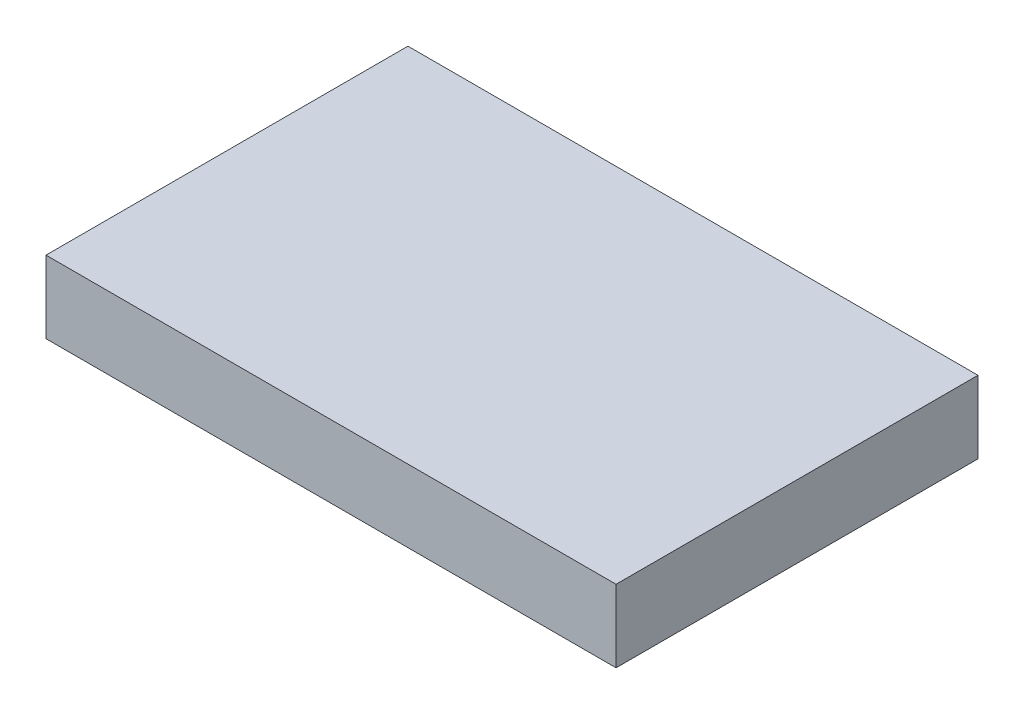
ISO-10303-21;
HEADER;
FILE_DESCRIPTION(('STEP AP214'),'2;1');
FILE_NAME('part.step','',(''),(''),'','','');
FILE_SCHEMA(('AUTOMOTIVE_DESIGN { 1 0 10303 214 1 1 1 1 }'));
ENDSEC;
DATA;
#1=APPLICATION_CONTEXT('core data for automotive mechanical design processes');
#2=APPLICATION_PROTOCOL_DEFINITION('international standard','automotive_design',2000,#1);
#3=PRODUCT_CONTEXT('',#1,'mechanical');
#4=PRODUCT('Part','Part','',(#3));
#5=PRODUCT_RELATED_PRODUCT_CATEGORY('part','',(#4));
#6=PRODUCT_DEFINITION_FORMATION('','',#4);
#7=PRODUCT_DEFINITION_CONTEXT('part definition',#1,'design');
#8=PRODUCT_DEFINITION('design','',#6,#7);
#9=PRODUCT_DEFINITION_SHAPE('','',#8);
#10=(LENGTH_UNIT() NAMED_UNIT(*) SI_UNIT(.MILLI.,.METRE.));
#11=(NAMED_UNIT(*) PLANE_ANGLE_UNIT() SI_UNIT($,.RADIAN.));
#12=(NAMED_UNIT(*) SI_UNIT($,.STERADIAN.) SOLID_ANGLE_UNIT());
#13=UNCERTAINTY_MEASURE_WITH_UNIT(LENGTH_MEASURE(1.E-05),#10,'distance_accuracy_value','');
#14=(GEOMETRIC_REPRESENTATION_CONTEXT(3) GLOBAL_UNCERTAINTY_ASSIGNED_CONTEXT((#13)) GLOBAL_UNIT_ASSIGNED_CONTEXT((#10,
#11,#12)) REPRESENTATION_CONTEXT('',''));
#15=CARTESIAN_POINT('',(0.,0.,0.));
#16=DIRECTION('',(0.,0.,1.));
#17=DIRECTION('',(1.,0.,0.));
#18=AXIS2_PLACEMENT_3D('',#15,#16,#17);
#19=CARTESIAN_POINT('',(0.,6.35000000000002,0.));
#20=DIRECTION('',(1.,0.,0.));
#21=DIRECTION('',(0.,0.,-1.));
#22=AXIS2_PLACEMENT_3D('',#19,#20,#21);
#23=PLANE('',#22);
#24=DIRECTION('',(0.,0.,1.));
#25=VECTOR('',#24,1.);
#26=CARTESIAN_POINT('',(0.,0.,0.));
#27=LINE('',#26,#25);
#28=CARTESIAN_POINT('',(0.,0.,-304.8));
#29=VERTEX_POINT('',#28);
#30=CARTESIAN_POINT('',(0.,0.,-273.05));
#31=VERTEX_POINT('',#30);
#32=EDGE_CURVE('E99',#29,#31,#27,.T.);
#33=ORIENTED_EDGE('',*,*,#32,.T.);
#34=DIRECTION('',(0.,1.,0.));
#35=VECTOR('',#34,1.);
#36=CARTESIAN_POINT('',(0.,0.,-273.05));
#37=LINE('',#36,#35);
#38=CARTESIAN_POINT('',(0.,6.35000000000002,-273.05));
#39=VERTEX_POINT('',#38);
#40=EDGE_CURVE('E48',#31,#39,#37,.T.);
#41=ORIENTED_EDGE('',*,*,#40,.T.);
#42=DIRECTION('',(0.,0.,1.));
#43=VECTOR('',#42,1.);
#44=CARTESIAN_POINT('',(0.,6.35000000000002,0.));
#45=LINE('',#44,#43);
#46=CARTESIAN_POINT('',(0.,6.35000000000002,-304.8));
#47=VERTEX_POINT('',#46);
#48=EDGE_CURVE('E101',#47,#39,#45,.T.);
#49=ORIENTED_EDGE('',*,*,#48,.F.);
#50=DIRECTION('',(0.,-1.,0.));
#51=VECTOR('',#50,1.);
#52=CARTESIAN_POINT('',(0.,6.35000000000002,-304.8));
#53=LINE('',#52,#51);
#54=EDGE_CURVE('E11',#47,#29,#53,.T.);
#55=ORIENTED_EDGE('',*,*,#54,.T.);
#56=EDGE_LOOP('',(#33,#41,#49,#55));
#57=FACE_BOUND('',#56,.T.);
#58=ADVANCED_FACE('F34',(#57),#23,.F.);
#59=CARTESIAN_POINT('',(0.,6.35000000000002,-304.8));
#60=DIRECTION('',(0.,0.,1.));
#61=DIRECTION('',(1.,0.,0.));
#62=AXIS2_PLACEMENT_3D('',#59,#60,#61);
#63=PLANE('',#62);
#64=DIRECTION('',(-1.,0.,0.));
#65=VECTOR('',#64,1.);
#66=CARTESIAN_POINT('',(0.,6.35000000000002,-304.8));
#67=LINE('',#66,#65);
#68=CARTESIAN_POINT('',(50.00625,6.35000000000002,-304.8));
#69=VERTEX_POINT('',#68);
#70=EDGE_CURVE('E41',#69,#47,#67,.T.);
#71=ORIENTED_EDGE('',*,*,#70,.F.);
#72=DIRECTION('',(0.,1.,0.));
#73=VECTOR('',#72,1.);
#74=CARTESIAN_POINT('',(50.00625,0.,-304.8));
#75=LINE('',#74,#73);
#76=CARTESIAN_POINT('',(50.00625,0.,-304.8));
#77=VERTEX_POINT('',#76);
#78=EDGE_CURVE('E97',#77,#69,#75,.T.);
#79=ORIENTED_EDGE('',*,*,#78,.F.);
#80=DIRECTION('',(-1.,0.,0.));
#81=VECTOR('',#80,1.);
#82=CARTESIAN_POINT('',(0.,0.,-304.8));
#83=LINE('',#82,#81);
#84=EDGE_CURVE('E91',#77,#29,#83,.T.);
#85=ORIENTED_EDGE('',*,*,#84,.T.);
#86=ORIENTED_EDGE('',*,*,#54,.F.);
#87=EDGE_LOOP('',(#71,#79,#85,#86));
#88=FACE_BOUND('',#87,.T.);
#89=ADVANCED_FACE('F105',(#88),#63,.F.);
#90=CARTESIAN_POINT('',(0.,6.35000000000002,0.));
#91=DIRECTION('',(0.,-1.,0.));
#92=DIRECTION('',(0.,0.,-1.));
#93=AXIS2_PLACEMENT_3D('',#90,#91,#92);
#94=PLANE('',#93);
#95=DIRECTION('',(-1.,0.,0.));
#96=VECTOR('',#95,1.);
#97=CARTESIAN_POINT('',(50.00625,6.35000000000002,-273.05));
#98=LINE('',#97,#96);
#99=CARTESIAN_POINT('',(50.00625,6.35000000000002,-273.05));
#100=VERTEX_POINT('',#99);
#101=EDGE_CURVE('E92',#100,#39,#98,.T.);
#102=ORIENTED_EDGE('',*,*,#101,.F.);
#103=DIRECTION('',(0.,0.,1.));
#104=VECTOR('',#103,1.);
#105=CARTESIAN_POINT('',(50.00625,6.35000000000002,-304.8));
#106=LINE('',#105,#104);
#107=EDGE_CURVE('E80',#69,#100,#106,.T.);
#108=ORIENTED_EDGE('',*,*,#107,.F.);
#109=ORIENTED_EDGE('',*,*,#70,.T.);
#110=ORIENTED_EDGE('',*,*,#48,.T.);
#111=EDGE_LOOP('',(#102,#108,#109,#110));
#112=FACE_BOUND('',#111,.T.);
#113=ADVANCED_FACE('F108',(#112),#94,.F.);
#114=CARTESIAN_POINT('',(0.,0.,0.));
#115=DIRECTION('',(0.,-1.,0.));
#116=DIRECTION('',(0.,0.,-1.));
#117=AXIS2_PLACEMENT_3D('',#114,#115,#116);
#118=PLANE('',#117);
#119=DIRECTION('',(0.,0.,1.));
#120=VECTOR('',#119,1.);
#121=CARTESIAN_POINT('',(50.00625,0.,-304.8));
#122=LINE('',#121,#120);
#123=CARTESIAN_POINT('',(50.00625,0.,-273.05));
#124=VERTEX_POINT('',#123);
#125=EDGE_CURVE('E78',#77,#124,#122,.T.);
#126=ORIENTED_EDGE('',*,*,#125,.T.);
#127=DIRECTION('',(-1.,0.,0.));
#128=VECTOR('',#127,1.);
#129=CARTESIAN_POINT('',(50.00625,0.,-273.05));
#130=LINE('',#129,#128);
#131=EDGE_CURVE('E82',#124,#31,#130,.T.);
#132=ORIENTED_EDGE('',*,*,#131,.T.);
#133=ORIENTED_EDGE('',*,*,#32,.F.);
#134=ORIENTED_EDGE('',*,*,#84,.F.);
#135=EDGE_LOOP('',(#126,#132,#133,#134));
#136=FACE_BOUND('',#135,.T.);
#137=ADVANCED_FACE('F90',(#136),#118,.T.);
#138=CARTESIAN_POINT('',(50.00625,0.,-304.8));
#139=DIRECTION('',(-1.,0.,0.));
#140=DIRECTION('',(0.,0.,1.));
#141=AXIS2_PLACEMENT_3D('',#138,#139,#140);
#142=PLANE('',#141);
#143=ORIENTED_EDGE('',*,*,#107,.T.);
#144=DIRECTION('',(0.,1.,0.));
#145=VECTOR('',#144,1.);
#146=CARTESIAN_POINT('',(50.00625,0.,-273.05));
#147=LINE('',#146,#145);
#148=EDGE_CURVE('E75',#124,#100,#147,.T.);
#149=ORIENTED_EDGE('',*,*,#148,.F.);
#150=ORIENTED_EDGE('',*,*,#125,.F.);
#151=ORIENTED_EDGE('',*,*,#78,.T.);
#152=EDGE_LOOP('',(#143,#149,#150,#151));
#153=FACE_BOUND('',#152,.T.);
#154=ADVANCED_FACE('F76',(#153),#142,.F.);
#155=CARTESIAN_POINT('',(50.00625,0.,-273.05));
#156=DIRECTION('',(0.,0.,-1.));
#157=DIRECTION('',(-1.,0.,0.));
#158=AXIS2_PLACEMENT_3D('',#155,#156,#157);
#159=PLANE('',#158);
#160=ORIENTED_EDGE('',*,*,#101,.T.);
#161=ORIENTED_EDGE('',*,*,#40,.F.);
#162=ORIENTED_EDGE('',*,*,#131,.F.);
#163=ORIENTED_EDGE('',*,*,#148,.T.);
#164=EDGE_LOOP('',(#160,#161,#162,#163));
#165=FACE_BOUND('',#164,.T.);
#166=ADVANCED_FACE('F84',(#165),#159,.F.);
#167=CLOSED_SHELL('',(#58,#89,#113,#137,#154,#166));
#168=MANIFOLD_SOLID_BREP('B2',#167);
#169=ADVANCED_BREP_SHAPE_REPRESENTATION('',(#18,#168),#14);
#170=SHAPE_DEFINITION_REPRESENTATION(#9,#169);
ENDSEC;
END-ISO-10303-21;
